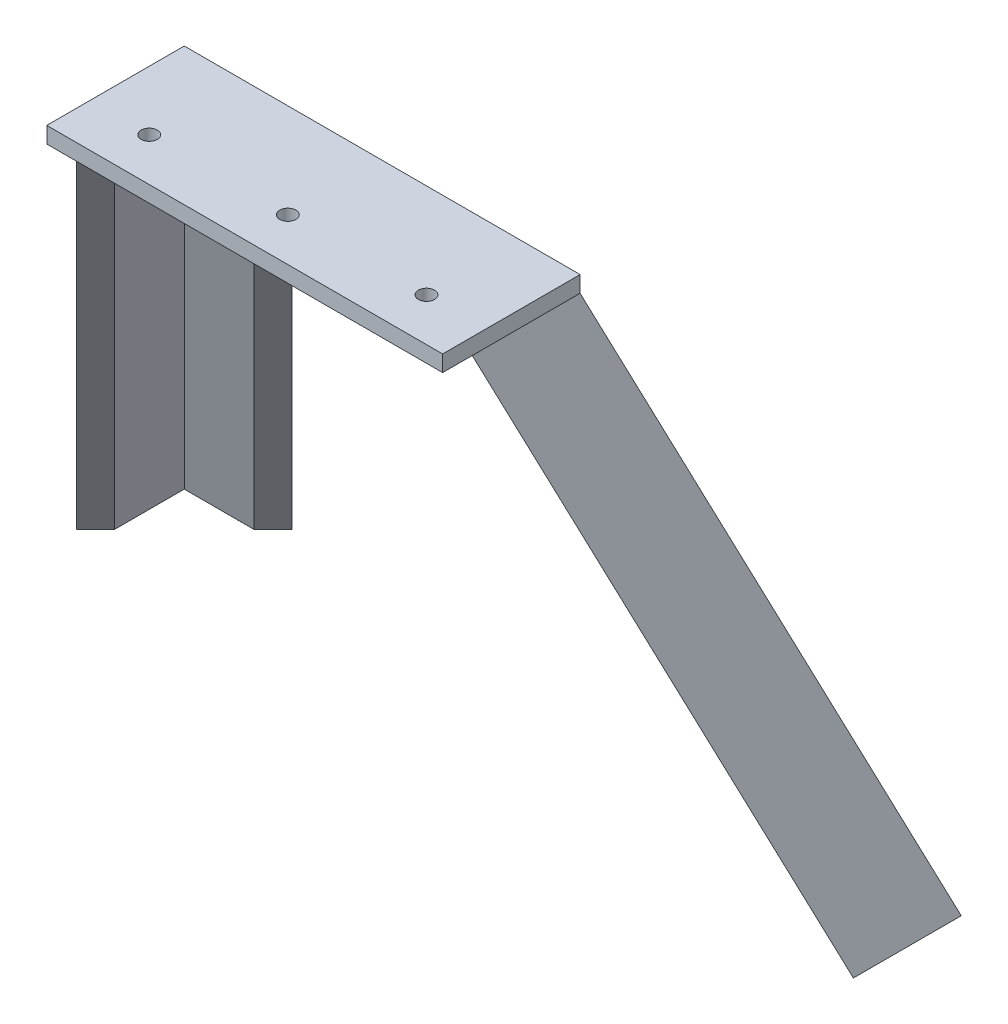
ISO-10303-21;
HEADER;
FILE_DESCRIPTION(('STEP AP214'),'2;1');
FILE_NAME('part.step','',(''),(''),'','','');
FILE_SCHEMA(('AUTOMOTIVE_DESIGN { 1 0 10303 214 1 1 1 1 }'));
ENDSEC;
DATA;
#1=APPLICATION_CONTEXT('core data for automotive mechanical design processes');
#2=APPLICATION_PROTOCOL_DEFINITION('international standard','automotive_design',2000,#1);
#3=PRODUCT_CONTEXT('',#1,'mechanical');
#4=PRODUCT('Part','Part','',(#3));
#5=PRODUCT_RELATED_PRODUCT_CATEGORY('part','',(#4));
#6=PRODUCT_DEFINITION_FORMATION('','',#4);
#7=PRODUCT_DEFINITION_CONTEXT('part definition',#1,'design');
#8=PRODUCT_DEFINITION('design','',#6,#7);
#9=PRODUCT_DEFINITION_SHAPE('','',#8);
#10=(LENGTH_UNIT() NAMED_UNIT(*) SI_UNIT(.MILLI.,.METRE.));
#11=(NAMED_UNIT(*) PLANE_ANGLE_UNIT() SI_UNIT($,.RADIAN.));
#12=(NAMED_UNIT(*) SI_UNIT($,.STERADIAN.) SOLID_ANGLE_UNIT());
#13=UNCERTAINTY_MEASURE_WITH_UNIT(LENGTH_MEASURE(1.E-05),#10,'distance_accuracy_value','');
#14=(GEOMETRIC_REPRESENTATION_CONTEXT(3) GLOBAL_UNCERTAINTY_ASSIGNED_CONTEXT((#13)) GLOBAL_UNIT_ASSIGNED_CONTEXT((#10,
#11,#12)) REPRESENTATION_CONTEXT('',''));
#15=CARTESIAN_POINT('',(0.,0.,0.));
#16=DIRECTION('',(0.,0.,1.));
#17=DIRECTION('',(1.,0.,0.));
#18=AXIS2_PLACEMENT_3D('',#15,#16,#17);
#19=CARTESIAN_POINT('',(31.4906110277381,37.9649951437628,-53.6906110277381));
#20=DIRECTION('',(-0.632455532033676,-0.447213595499958,0.632455532033676));
#21=DIRECTION('',(-0.707106781186548,0.,-0.707106781186548));
#22=AXIS2_PLACEMENT_3D('',#19,#20,#21);
#23=PLANE('',#22);
#24=DIRECTION('',(0.316227766016838,-0.894427190999916,-0.316227766016838));
#25=VECTOR('',#24,1.);
#26=CARTESIAN_POINT('',(9.13098442995433,100.,-32.184865020736));
#27=LINE('',#26,#25);
#28=CARTESIAN_POINT('',(9.13098442995433,100.,-32.184865020736));
#29=VERTEX_POINT('',#28);
#30=CARTESIAN_POINT('',(44.4863234892817,0.,-67.5402040800634));
#31=VERTEX_POINT('',#30);
#32=EDGE_CURVE('E216',#29,#31,#27,.T.);
#33=ORIENTED_EDGE('',*,*,#32,.F.);
#34=CARTESIAN_POINT('',(9.13098442995434,100.,-32.184865020736));
#35=DIRECTION('',(-0.707106781186547,0.,-0.707106781186547));
#36=VECTOR('',#35,1.);
#37=LINE('',#34,#36);
#38=CARTESIAN_POINT('',(5.5954505240216,100.,-35.7203989266688));
#39=VERTEX_POINT('',#38);
#40=EDGE_CURVE('E227',#29,#39,#37,.T.);
#41=ORIENTED_EDGE('',*,*,#40,.T.);
#42=DIRECTION('',(0.316227766016838,-0.894427190999916,-0.316227766016838));
#43=VECTOR('',#42,1.);
#44=CARTESIAN_POINT('',(5.5954505240216,100.,-35.7203989266688));
#45=LINE('',#44,#43);
#46=CARTESIAN_POINT('',(40.950789583349,0.,-71.0757379859962));
#47=VERTEX_POINT('',#46);
#48=EDGE_CURVE('E367',#39,#47,#45,.T.);
#49=ORIENTED_EDGE('',*,*,#48,.T.);
#50=CARTESIAN_POINT('',(44.4863234892817,0.,-67.5402040800634));
#51=DIRECTION('',(-0.707106781186547,0.,-0.707106781186547));
#52=VECTOR('',#51,1.);
#53=LINE('',#50,#52);
#54=EDGE_CURVE('E288',#31,#47,#53,.T.);
#55=ORIENTED_EDGE('',*,*,#54,.F.);
#56=EDGE_LOOP('',(#33,#41,#49,#55));
#57=FACE_BOUND('',#56,.T.);
#58=ADVANCED_FACE('F97',(#57),#23,.T.);
#59=CARTESIAN_POINT('',(-53.6906110277381,37.9649951437628,-53.6906110277381));
#60=DIRECTION('',(0.632455532033676,-0.447213595499958,0.632455532033676));
#61=DIRECTION('',(0.707106781186548,0.,-0.707106781186548));
#62=AXIS2_PLACEMENT_3D('',#59,#60,#61);
#63=PLANE('',#62);
#64=DIRECTION('',(-0.316227766016838,-0.894427190999916,-0.316227766016838));
#65=VECTOR('',#64,1.);
#66=CARTESIAN_POINT('',(-31.3309844299543,100.,-32.184865020736));
#67=LINE('',#66,#65);
#68=CARTESIAN_POINT('',(-31.3309844299543,100.,-32.184865020736));
#69=VERTEX_POINT('',#68);
#70=CARTESIAN_POINT('',(-66.6863234892817,0.,-67.5402040800634));
#71=VERTEX_POINT('',#70);
#72=EDGE_CURVE('E454',#69,#71,#67,.T.);
#73=ORIENTED_EDGE('',*,*,#72,.T.);
#74=DIRECTION('',(0.707106781186548,0.,-0.707106781186548));
#75=VECTOR('',#74,1.);
#76=CARTESIAN_POINT('',(-63.150789583349,0.,-71.0757379859962));
#77=LINE('',#76,#75);
#78=CARTESIAN_POINT('',(-63.150789583349,0.,-71.0757379859962));
#79=VERTEX_POINT('',#78);
#80=EDGE_CURVE('E566',#71,#79,#77,.T.);
#81=ORIENTED_EDGE('',*,*,#80,.T.);
#82=DIRECTION('',(-0.316227766016838,-0.894427190999916,-0.316227766016838));
#83=VECTOR('',#82,1.);
#84=CARTESIAN_POINT('',(-27.7954505240216,100.,-35.7203989266688));
#85=LINE('',#84,#83);
#86=CARTESIAN_POINT('',(-27.7954505240216,100.,-35.7203989266688));
#87=VERTEX_POINT('',#86);
#88=EDGE_CURVE('E572',#87,#79,#85,.T.);
#89=ORIENTED_EDGE('',*,*,#88,.F.);
#90=DIRECTION('',(0.707106781186548,0.,-0.707106781186548));
#91=VECTOR('',#90,1.);
#92=CARTESIAN_POINT('',(-27.7954505240216,100.,-35.7203989266688));
#93=LINE('',#92,#91);
#94=EDGE_CURVE('E464',#69,#87,#93,.T.);
#95=ORIENTED_EDGE('',*,*,#94,.F.);
#96=EDGE_LOOP('',(#73,#81,#89,#95));
#97=FACE_BOUND('',#96,.T.);
#98=ADVANCED_FACE('F408',(#97),#63,.T.);
#99=CARTESIAN_POINT('',(-47.7954505240216,103.,-35.7203989266688));
#100=DIRECTION('',(1.,0.,0.));
#101=DIRECTION('',(0.,0.,-1.));
#102=AXIS2_PLACEMENT_3D('',#99,#100,#101);
#103=PLANE('',#102);
#104=CARTESIAN_POINT('',(-47.7954505240216,100.,-35.7203989266688));
#105=DIRECTION('',(0.,0.,1.));
#106=VECTOR('',#105,1.);
#107=LINE('',#104,#106);
#108=CARTESIAN_POINT('',(-47.7954505240216,100.,-35.7203989266688));
#109=VERTEX_POINT('',#108);
#110=CARTESIAN_POINT('',(-47.7954505240216,100.,-15.7203989266688));
#111=VERTEX_POINT('',#110);
#112=EDGE_CURVE('E489',#109,#111,#107,.T.);
#113=ORIENTED_EDGE('',*,*,#112,.T.);
#114=DIRECTION('',(0.,0.,1.));
#115=VECTOR('',#114,1.);
#116=CARTESIAN_POINT('',(-47.7954505240216,100.,-35.7203989266688));
#117=LINE('',#116,#115);
#118=CARTESIAN_POINT('',(-47.7954505240216,100.,-10.2203989266688));
#119=VERTEX_POINT('',#118);
#120=EDGE_CURVE('E461',#111,#119,#117,.T.);
#121=ORIENTED_EDGE('',*,*,#120,.T.);
#122=DIRECTION('',(0.,-1.,0.));
#123=VECTOR('',#122,1.);
#124=CARTESIAN_POINT('',(-47.7954505240216,103.,-10.2203989266688));
#125=LINE('',#124,#123);
#126=CARTESIAN_POINT('',(-47.7954505240216,103.,-10.2203989266688));
#127=VERTEX_POINT('',#126);
#128=EDGE_CURVE('E12',#127,#119,#125,.T.);
#129=ORIENTED_EDGE('',*,*,#128,.F.);
#130=DIRECTION('',(0.,0.,1.));
#131=VECTOR('',#130,1.);
#132=CARTESIAN_POINT('',(-47.7954505240216,103.,-35.7203989266688));
#133=LINE('',#132,#131);
#134=CARTESIAN_POINT('',(-47.7954505240216,103.,-35.7203989266688));
#135=VERTEX_POINT('',#134);
#136=EDGE_CURVE('E470',#135,#127,#133,.T.);
#137=ORIENTED_EDGE('',*,*,#136,.F.);
#138=DIRECTION('',(0.,-1.,0.));
#139=VECTOR('',#138,1.);
#140=CARTESIAN_POINT('',(-47.7954505240216,103.,-35.7203989266688));
#141=LINE('',#140,#139);
#142=EDGE_CURVE('E496',#135,#109,#141,.T.);
#143=ORIENTED_EDGE('',*,*,#142,.T.);
#144=EDGE_LOOP('',(#113,#121,#129,#137,#143));
#145=FACE_BOUND('',#144,.T.);
#146=ADVANCED_FACE('F99',(#145),#103,.F.);
#147=CARTESIAN_POINT('',(-47.7954505240216,103.,-10.2203989266688));
#148=DIRECTION('',(0.,0.,-1.));
#149=DIRECTION('',(-1.,0.,0.));
#150=AXIS2_PLACEMENT_3D('',#147,#148,#149);
#151=PLANE('',#150);
#152=DIRECTION('',(1.,0.,0.));
#153=VECTOR('',#152,1.);
#154=CARTESIAN_POINT('',(-47.7954505240216,100.,-10.2203989266688));
#155=LINE('',#154,#153);
#156=CARTESIAN_POINT('',(25.6259057159784,100.,-10.2203989266688));
#157=VERTEX_POINT('',#156);
#158=EDGE_CURVE('E483',#119,#157,#155,.T.);
#159=ORIENTED_EDGE('',*,*,#158,.T.);
#160=DIRECTION('',(0.,-1.,0.));
#161=VECTOR('',#160,1.);
#162=CARTESIAN_POINT('',(25.6259057159784,103.,-10.2203989266688));
#163=LINE('',#162,#161);
#164=CARTESIAN_POINT('',(25.6259057159784,103.,-10.2203989266688));
#165=VERTEX_POINT('',#164);
#166=EDGE_CURVE('E110',#165,#157,#163,.T.);
#167=ORIENTED_EDGE('',*,*,#166,.F.);
#168=DIRECTION('',(1.,0.,0.));
#169=VECTOR('',#168,1.);
#170=CARTESIAN_POINT('',(-47.7954505240216,103.,-10.2203989266688));
#171=LINE('',#170,#169);
#172=EDGE_CURVE('E499',#127,#165,#171,.T.);
#173=ORIENTED_EDGE('',*,*,#172,.F.);
#174=ORIENTED_EDGE('',*,*,#128,.T.);
#175=EDGE_LOOP('',(#159,#167,#173,#174));
#176=FACE_BOUND('',#175,.T.);
#177=ADVANCED_FACE('F421',(#176),#151,.F.);
#178=CARTESIAN_POINT('',(25.6259057159784,103.,-35.7203989266688));
#179=DIRECTION('',(-1.,0.,0.));
#180=DIRECTION('',(0.,0.,1.));
#181=AXIS2_PLACEMENT_3D('',#178,#179,#180);
#182=PLANE('',#181);
#183=DIRECTION('',(0.,0.,-1.));
#184=VECTOR('',#183,1.);
#185=CARTESIAN_POINT('',(25.6259057159784,100.,-35.7203989266688));
#186=LINE('',#185,#184);
#187=CARTESIAN_POINT('',(25.6259057159784,100.,-35.7203989266688));
#188=VERTEX_POINT('',#187);
#189=EDGE_CURVE('E476',#157,#188,#186,.T.);
#190=ORIENTED_EDGE('',*,*,#189,.T.);
#191=DIRECTION('',(0.,-1.,0.));
#192=VECTOR('',#191,1.);
#193=CARTESIAN_POINT('',(25.6259057159784,103.,-35.7203989266688));
#194=LINE('',#193,#192);
#195=CARTESIAN_POINT('',(25.6259057159784,103.,-35.7203989266688));
#196=VERTEX_POINT('',#195);
#197=EDGE_CURVE('E478',#196,#188,#194,.T.);
#198=ORIENTED_EDGE('',*,*,#197,.F.);
#199=DIRECTION('',(0.,0.,-1.));
#200=VECTOR('',#199,1.);
#201=CARTESIAN_POINT('',(25.6259057159784,103.,-35.7203989266688));
#202=LINE('',#201,#200);
#203=EDGE_CURVE('E497',#165,#196,#202,.T.);
#204=ORIENTED_EDGE('',*,*,#203,.F.);
#205=ORIENTED_EDGE('',*,*,#166,.T.);
#206=EDGE_LOOP('',(#190,#198,#204,#205));
#207=FACE_BOUND('',#206,.T.);
#208=ADVANCED_FACE('F729',(#207),#182,.F.);
#209=CARTESIAN_POINT('',(-47.7954505240216,103.,-35.7203989266688));
#210=DIRECTION('',(0.,0.,1.));
#211=DIRECTION('',(1.,0.,0.));
#212=AXIS2_PLACEMENT_3D('',#209,#210,#211);
#213=PLANE('',#212);
#214=DIRECTION('',(-1.,0.,0.));
#215=VECTOR('',#214,1.);
#216=CARTESIAN_POINT('',(-47.7954505240216,100.,-35.7203989266688));
#217=LINE('',#216,#215);
#218=CARTESIAN_POINT('',(25.5954505240216,100.,-35.7203989266688));
#219=VERTEX_POINT('',#218);
#220=EDGE_CURVE('E467',#188,#219,#217,.T.);
#221=ORIENTED_EDGE('',*,*,#220,.T.);
#222=CARTESIAN_POINT('',(25.5954505240216,100.,-35.7203989266688));
#223=DIRECTION('',(-1.,0.,0.));
#224=VECTOR('',#223,1.);
#225=LINE('',#222,#224);
#226=EDGE_CURVE('E363',#219,#39,#225,.T.);
#227=ORIENTED_EDGE('',*,*,#226,.T.);
#228=EDGE_CURVE('E471',#39,#87,#217,.T.);
#229=ORIENTED_EDGE('',*,*,#228,.T.);
#230=DIRECTION('',(-1.,0.,0.));
#231=VECTOR('',#230,1.);
#232=CARTESIAN_POINT('',(-47.7954505240216,100.,-35.7203989266688));
#233=LINE('',#232,#231);
#234=EDGE_CURVE('E463',#87,#109,#233,.T.);
#235=ORIENTED_EDGE('',*,*,#234,.T.);
#236=ORIENTED_EDGE('',*,*,#142,.F.);
#237=DIRECTION('',(-1.,0.,0.));
#238=VECTOR('',#237,1.);
#239=CARTESIAN_POINT('',(-47.7954505240216,103.,-35.7203989266688));
#240=LINE('',#239,#238);
#241=EDGE_CURVE('E494',#196,#135,#240,.T.);
#242=ORIENTED_EDGE('',*,*,#241,.F.);
#243=ORIENTED_EDGE('',*,*,#197,.T.);
#244=EDGE_LOOP('',(#221,#227,#229,#235,#236,#242,#243));
#245=FACE_BOUND('',#244,.T.);
#246=ADVANCED_FACE('F311',(#245),#213,.F.);
#247=CARTESIAN_POINT('',(0.,103.,0.));
#248=DIRECTION('',(0.,1.,0.));
#249=DIRECTION('',(0.,0.,1.));
#250=AXIS2_PLACEMENT_3D('',#247,#248,#249);
#251=PLANE('',#250);
#252=CARTESIAN_POINT('',(-36.7954505240216,103.,-18.2203989266688));
#253=DIRECTION('',(0.,1.,0.));
#254=DIRECTION('',(0.,0.,1.));
#255=AXIS2_PLACEMENT_3D('',#252,#253,#254);
#256=CIRCLE('',#255,1.5);
#257=CARTESIAN_POINT('',(-36.7954505240216,103.,-16.7203989266688));
#258=VERTEX_POINT('',#257);
#259=EDGE_CURVE('E516',#258,#258,#256,.T.);
#260=ORIENTED_EDGE('',*,*,#259,.F.);
#261=EDGE_LOOP('',(#260));
#262=FACE_BOUND('',#261,.T.);
#263=CARTESIAN_POINT('',(14.6259057159784,103.,-18.2203989266688));
#264=DIRECTION('',(0.,1.,0.));
#265=DIRECTION('',(0.,0.,1.));
#266=AXIS2_PLACEMENT_3D('',#263,#264,#265);
#267=CIRCLE('',#266,1.5);
#268=CARTESIAN_POINT('',(14.6259057159784,103.,-16.7203989266688));
#269=VERTEX_POINT('',#268);
#270=EDGE_CURVE('E510',#269,#269,#267,.T.);
#271=ORIENTED_EDGE('',*,*,#270,.F.);
#272=EDGE_LOOP('',(#271));
#273=FACE_BOUND('',#272,.T.);
#274=CARTESIAN_POINT('',(-11.0847724040216,103.,-18.2203989266688));
#275=DIRECTION('',(0.,1.,0.));
#276=DIRECTION('',(0.,0.,1.));
#277=AXIS2_PLACEMENT_3D('',#274,#275,#276);
#278=CIRCLE('',#277,1.5);
#279=CARTESIAN_POINT('',(-11.0847724040216,103.,-16.7203989266688));
#280=VERTEX_POINT('',#279);
#281=EDGE_CURVE('E503',#280,#280,#278,.T.);
#282=ORIENTED_EDGE('',*,*,#281,.F.);
#283=EDGE_LOOP('',(#282));
#284=FACE_BOUND('',#283,.T.);
#285=ORIENTED_EDGE('',*,*,#136,.T.);
#286=ORIENTED_EDGE('',*,*,#172,.T.);
#287=ORIENTED_EDGE('',*,*,#203,.T.);
#288=ORIENTED_EDGE('',*,*,#241,.T.);
#289=EDGE_LOOP('',(#285,#286,#287,#288));
#290=FACE_BOUND('',#289,.T.);
#291=ADVANCED_FACE('F308',(#262,#273,#284,#290),#251,.T.);
#292=CARTESIAN_POINT('',(0.,100.,0.));
#293=DIRECTION('',(0.,1.,0.));
#294=DIRECTION('',(0.,0.,1.));
#295=AXIS2_PLACEMENT_3D('',#292,#293,#294);
#296=PLANE('',#295);
#297=CARTESIAN_POINT('',(-36.7954505240216,100.,-18.2203989266688));
#298=DIRECTION('',(0.,1.,0.));
#299=DIRECTION('',(0.,0.,1.));
#300=AXIS2_PLACEMENT_3D('',#297,#298,#299);
#301=CIRCLE('',#300,1.5);
#302=CARTESIAN_POINT('',(-36.7954505240216,100.,-16.7203989266688));
#303=VERTEX_POINT('',#302);
#304=EDGE_CURVE('E519',#303,#303,#301,.T.);
#305=ORIENTED_EDGE('',*,*,#304,.T.);
#306=EDGE_LOOP('',(#305));
#307=FACE_BOUND('',#306,.T.);
#308=CARTESIAN_POINT('',(14.6259057159784,100.,-18.2203989266688));
#309=DIRECTION('',(0.,1.,0.));
#310=DIRECTION('',(0.,0.,1.));
#311=AXIS2_PLACEMENT_3D('',#308,#309,#310);
#312=CIRCLE('',#311,1.5);
#313=CARTESIAN_POINT('',(14.6259057159784,100.,-16.7203989266688));
#314=VERTEX_POINT('',#313);
#315=EDGE_CURVE('E513',#314,#314,#312,.T.);
#316=ORIENTED_EDGE('',*,*,#315,.T.);
#317=EDGE_LOOP('',(#316));
#318=FACE_BOUND('',#317,.T.);
#319=CARTESIAN_POINT('',(-11.0847724040216,100.,-18.2203989266688));
#320=DIRECTION('',(0.,1.,0.));
#321=DIRECTION('',(0.,0.,1.));
#322=AXIS2_PLACEMENT_3D('',#319,#320,#321);
#323=CIRCLE('',#322,1.5);
#324=CARTESIAN_POINT('',(-11.0847724040216,100.,-16.7203989266688));
#325=VERTEX_POINT('',#324);
#326=EDGE_CURVE('E506',#325,#325,#323,.T.);
#327=ORIENTED_EDGE('',*,*,#326,.T.);
#328=EDGE_LOOP('',(#327));
#329=FACE_BOUND('',#328,.T.);
#330=ORIENTED_EDGE('',*,*,#228,.F.);
#331=ORIENTED_EDGE('',*,*,#40,.F.);
#332=CARTESIAN_POINT('',(9.13098442995433,100.,-32.184865020736));
#333=DIRECTION('',(1.,0.,0.));
#334=VECTOR('',#333,1.);
#335=LINE('',#332,#334);
#336=CARTESIAN_POINT('',(22.0599166180889,100.,-32.184865020736));
#337=VERTEX_POINT('',#336);
#338=EDGE_CURVE('E210',#29,#337,#335,.T.);
#339=ORIENTED_EDGE('',*,*,#338,.T.);
#340=CARTESIAN_POINT('',(22.0599166180889,100.,-32.184865020736));
#341=DIRECTION('',(0.,0.,1.));
#342=VECTOR('',#341,1.);
#343=LINE('',#340,#342);
#344=CARTESIAN_POINT('',(22.0599166180889,100.,-19.2559328326015));
#345=VERTEX_POINT('',#344);
#346=EDGE_CURVE('E224',#337,#345,#343,.T.);
#347=ORIENTED_EDGE('',*,*,#346,.T.);
#348=CARTESIAN_POINT('',(25.5954505240216,100.,-15.7203989266688));
#349=DIRECTION('',(-0.707106781186548,0.,-0.707106781186548));
#350=VECTOR('',#349,1.);
#351=LINE('',#348,#350);
#352=CARTESIAN_POINT('',(25.5954505240216,100.,-15.7203989266688));
#353=VERTEX_POINT('',#352);
#354=EDGE_CURVE('E362',#353,#345,#351,.T.);
#355=ORIENTED_EDGE('',*,*,#354,.F.);
#356=DIRECTION('',(0.,0.,-1.));
#357=VECTOR('',#356,1.);
#358=CARTESIAN_POINT('',(25.5954505240216,100.,0.));
#359=LINE('',#358,#357);
#360=EDGE_CURVE('E294',#219,#353,#359,.F.);
#361=ORIENTED_EDGE('',*,*,#360,.F.);
#362=ORIENTED_EDGE('',*,*,#220,.F.);
#363=ORIENTED_EDGE('',*,*,#189,.F.);
#364=ORIENTED_EDGE('',*,*,#158,.F.);
#365=ORIENTED_EDGE('',*,*,#120,.F.);
#366=CARTESIAN_POINT('',(-44.2599166180888,100.,-19.2559328326015));
#367=VERTEX_POINT('',#366);
#368=EDGE_CURVE('E445',#111,#367,#93,.T.);
#369=ORIENTED_EDGE('',*,*,#368,.T.);
#370=DIRECTION('',(0.,0.,1.));
#371=VECTOR('',#370,1.);
#372=CARTESIAN_POINT('',(-44.2599166180889,100.,-32.184865020736));
#373=LINE('',#372,#371);
#374=CARTESIAN_POINT('',(-44.2599166180889,100.,-32.184865020736));
#375=VERTEX_POINT('',#374);
#376=EDGE_CURVE('E387',#375,#367,#373,.T.);
#377=ORIENTED_EDGE('',*,*,#376,.F.);
#378=DIRECTION('',(-1.,0.,0.));
#379=VECTOR('',#378,1.);
#380=CARTESIAN_POINT('',(-44.2599166180889,100.,-32.184865020736));
#381=LINE('',#380,#379);
#382=EDGE_CURVE('E389',#69,#375,#381,.T.);
#383=ORIENTED_EDGE('',*,*,#382,.F.);
#384=ORIENTED_EDGE('',*,*,#94,.T.);
#385=EDGE_LOOP('',(#330,#331,#339,#347,#355,#361,#362,#363,#364,#365,#369,#377,#383,#384));
#386=FACE_BOUND('',#385,.T.);
#387=ADVANCED_FACE('F222',(#307,#318,#329,#386),#296,.F.);
#388=CARTESIAN_POINT('',(-11.0847724040216,100.,-18.2203989266688));
#389=DIRECTION('',(0.,1.,0.));
#390=DIRECTION('',(0.,0.,1.));
#391=AXIS2_PLACEMENT_3D('',#388,#389,#390);
#392=CYLINDRICAL_SURFACE('',#391,1.5);
#393=ORIENTED_EDGE('',*,*,#326,.F.);
#394=EDGE_LOOP('',(#393));
#395=FACE_BOUND('',#394,.T.);
#396=ORIENTED_EDGE('',*,*,#281,.T.);
#397=EDGE_LOOP('',(#396));
#398=FACE_BOUND('',#397,.T.);
#399=ADVANCED_FACE('F307',(#395,#398),#392,.F.);
#400=CARTESIAN_POINT('',(14.6259057159784,100.,-18.2203989266688));
#401=DIRECTION('',(0.,1.,0.));
#402=DIRECTION('',(0.,0.,1.));
#403=AXIS2_PLACEMENT_3D('',#400,#401,#402);
#404=CYLINDRICAL_SURFACE('',#403,1.5);
#405=ORIENTED_EDGE('',*,*,#315,.F.);
#406=EDGE_LOOP('',(#405));
#407=FACE_BOUND('',#406,.T.);
#408=ORIENTED_EDGE('',*,*,#270,.T.);
#409=EDGE_LOOP('',(#408));
#410=FACE_BOUND('',#409,.T.);
#411=ADVANCED_FACE('F751',(#407,#410),#404,.F.);
#412=CARTESIAN_POINT('',(-36.7954505240216,100.,-18.2203989266688));
#413=DIRECTION('',(0.,1.,0.));
#414=DIRECTION('',(0.,0.,1.));
#415=AXIS2_PLACEMENT_3D('',#412,#413,#414);
#416=CYLINDRICAL_SURFACE('',#415,1.5);
#417=ORIENTED_EDGE('',*,*,#304,.F.);
#418=EDGE_LOOP('',(#417));
#419=FACE_BOUND('',#418,.T.);
#420=ORIENTED_EDGE('',*,*,#259,.T.);
#421=EDGE_LOOP('',(#420));
#422=FACE_BOUND('',#421,.T.);
#423=ADVANCED_FACE('F437',(#419,#422),#416,.F.);
#424=CARTESIAN_POINT('',(0.,0.,0.));
#425=DIRECTION('',(0.,-1.,0.));
#426=DIRECTION('',(0.,0.,-1.));
#427=AXIS2_PLACEMENT_3D('',#424,#425,#426);
#428=PLANE('',#427);
#429=DIRECTION('',(-1.,0.,0.));
#430=VECTOR('',#429,1.);
#431=CARTESIAN_POINT('',(-79.6152556774162,0.,-67.5402040800634));
#432=LINE('',#431,#430);
#433=CARTESIAN_POINT('',(-79.6152556774162,0.,-67.5402040800634));
#434=VERTEX_POINT('',#433);
#435=EDGE_CURVE('E610',#71,#434,#432,.T.);
#436=ORIENTED_EDGE('',*,*,#435,.T.);
#437=DIRECTION('',(0.,0.,1.));
#438=VECTOR('',#437,1.);
#439=CARTESIAN_POINT('',(-79.6152556774162,0.,-67.5402040800634));
#440=LINE('',#439,#438);
#441=CARTESIAN_POINT('',(-79.6152556774162,0.,-54.6112718919289));
#442=VERTEX_POINT('',#441);
#443=EDGE_CURVE('E611',#434,#442,#440,.T.);
#444=ORIENTED_EDGE('',*,*,#443,.T.);
#445=CARTESIAN_POINT('',(-83.150789583349,0.,-51.0757379859962));
#446=VERTEX_POINT('',#445);
#447=EDGE_CURVE('E449',#446,#442,#77,.T.);
#448=ORIENTED_EDGE('',*,*,#447,.F.);
#449=DIRECTION('',(0.,0.,1.));
#450=VECTOR('',#449,1.);
#451=CARTESIAN_POINT('',(-83.150789583349,0.,-51.0757379859962));
#452=LINE('',#451,#450);
#453=CARTESIAN_POINT('',(-83.150789583349,0.,-71.0757379859962));
#454=VERTEX_POINT('',#453);
#455=EDGE_CURVE('E550',#454,#446,#452,.T.);
#456=ORIENTED_EDGE('',*,*,#455,.F.);
#457=DIRECTION('',(-1.,0.,0.));
#458=VECTOR('',#457,1.);
#459=CARTESIAN_POINT('',(-83.150789583349,0.,-71.0757379859962));
#460=LINE('',#459,#458);
#461=EDGE_CURVE('E507',#79,#454,#460,.T.);
#462=ORIENTED_EDGE('',*,*,#461,.F.);
#463=ORIENTED_EDGE('',*,*,#80,.F.);
#464=EDGE_LOOP('',(#436,#444,#448,#456,#462,#463));
#465=FACE_BOUND('',#464,.T.);
#466=ADVANCED_FACE('F429',(#465),#428,.T.);
#467=DIRECTION('',(-0.316227766016838,-0.894427190999916,-0.316227766016838));
#468=VECTOR('',#467,1.);
#469=CARTESIAN_POINT('',(-44.2599166180889,100.,-19.2559328326015));
#470=LINE('',#469,#468);
#471=EDGE_CURVE('E442',#367,#442,#470,.T.);
#472=ORIENTED_EDGE('',*,*,#471,.F.);
#473=ORIENTED_EDGE('',*,*,#368,.F.);
#474=DIRECTION('',(-0.316227766016838,-0.894427190999916,-0.316227766016838));
#475=VECTOR('',#474,1.);
#476=CARTESIAN_POINT('',(-47.7954505240216,100.,-15.7203989266688));
#477=LINE('',#476,#475);
#478=EDGE_CURVE('E576',#111,#446,#477,.T.);
#479=ORIENTED_EDGE('',*,*,#478,.T.);
#480=ORIENTED_EDGE('',*,*,#447,.T.);
#481=EDGE_LOOP('',(#472,#473,#479,#480));
#482=FACE_BOUND('',#481,.T.);
#483=ADVANCED_FACE('F415',(#482),#63,.T.);
#484=CARTESIAN_POINT('',(0.,22.336949470105,-63.1784337653299));
#485=DIRECTION('',(0.,0.333333333333333,-0.942809041582063));
#486=DIRECTION('',(0.,0.942809041582063,0.333333333333333));
#487=AXIS2_PLACEMENT_3D('',#484,#485,#486);
#488=PLANE('',#487);
#489=ORIENTED_EDGE('',*,*,#88,.T.);
#490=ORIENTED_EDGE('',*,*,#461,.T.);
#491=DIRECTION('',(-0.316227766016838,-0.894427190999916,-0.316227766016838));
#492=VECTOR('',#491,1.);
#493=CARTESIAN_POINT('',(-47.7954505240216,100.,-35.7203989266688));
#494=LINE('',#493,#492);
#495=EDGE_CURVE('E575',#109,#454,#494,.T.);
#496=ORIENTED_EDGE('',*,*,#495,.F.);
#497=ORIENTED_EDGE('',*,*,#234,.F.);
#498=EDGE_LOOP('',(#489,#490,#496,#497));
#499=FACE_BOUND('',#498,.T.);
#500=ADVANCED_FACE('F428',(#499),#488,.T.);
#501=CARTESIAN_POINT('',(-73.9118129629769,26.1317720779564,0.));
#502=DIRECTION('',(-0.942809041582063,0.333333333333333,0.));
#503=DIRECTION('',(-0.333333333333333,-0.942809041582063,0.));
#504=AXIS2_PLACEMENT_3D('',#501,#502,#503);
#505=PLANE('',#504);
#506=ORIENTED_EDGE('',*,*,#495,.T.);
#507=ORIENTED_EDGE('',*,*,#455,.T.);
#508=ORIENTED_EDGE('',*,*,#478,.F.);
#509=ORIENTED_EDGE('',*,*,#112,.F.);
#510=EDGE_LOOP('',(#506,#507,#508,#509));
#511=FACE_BOUND('',#510,.T.);
#512=ADVANCED_FACE('F435',(#511),#505,.T.);
#513=CARTESIAN_POINT('',(0.,21.2258383589938,-60.0357369600564));
#514=DIRECTION('',(0.,0.333333333333333,-0.942809041582063));
#515=DIRECTION('',(0.,0.942809041582063,0.333333333333333));
#516=AXIS2_PLACEMENT_3D('',#513,#514,#515);
#517=PLANE('',#516);
#518=ORIENTED_EDGE('',*,*,#72,.F.);
#519=ORIENTED_EDGE('',*,*,#382,.T.);
#520=DIRECTION('',(-0.316227766016838,-0.894427190999916,-0.316227766016838));
#521=VECTOR('',#520,1.);
#522=CARTESIAN_POINT('',(-44.2599166180889,100.,-32.184865020736));
#523=LINE('',#522,#521);
#524=EDGE_CURVE('E646',#375,#434,#523,.T.);
#525=ORIENTED_EDGE('',*,*,#524,.T.);
#526=ORIENTED_EDGE('',*,*,#435,.F.);
#527=EDGE_LOOP('',(#518,#519,#525,#526));
#528=FACE_BOUND('',#527,.T.);
#529=ADVANCED_FACE('F658',(#528),#517,.F.);
#530=CARTESIAN_POINT('',(-70.7691161577033,25.0206609668452,0.));
#531=DIRECTION('',(-0.942809041582063,0.333333333333333,0.));
#532=DIRECTION('',(-0.333333333333333,-0.942809041582063,0.));
#533=AXIS2_PLACEMENT_3D('',#530,#531,#532);
#534=PLANE('',#533);
#535=ORIENTED_EDGE('',*,*,#524,.F.);
#536=ORIENTED_EDGE('',*,*,#376,.T.);
#537=ORIENTED_EDGE('',*,*,#471,.T.);
#538=ORIENTED_EDGE('',*,*,#443,.F.);
#539=EDGE_LOOP('',(#535,#536,#537,#538));
#540=FACE_BOUND('',#539,.T.);
#541=ADVANCED_FACE('F656',(#540),#534,.F.);
#542=CARTESIAN_POINT('',(-22.2,0.,0.));
#543=DIRECTION('',(0.,-1.,0.));
#544=DIRECTION('',(0.,0.,-1.));
#545=AXIS2_PLACEMENT_3D('',#542,#543,#544);
#546=PLANE('',#545);
#547=DIRECTION('',(1.,0.,0.));
#548=VECTOR('',#547,1.);
#549=CARTESIAN_POINT('',(-22.2,0.,-67.5402040800634));
#550=LINE('',#549,#548);
#551=CARTESIAN_POINT('',(57.4152556774162,0.,-67.5402040800634));
#552=VERTEX_POINT('',#551);
#553=EDGE_CURVE('E214',#31,#552,#550,.T.);
#554=ORIENTED_EDGE('',*,*,#553,.F.);
#555=ORIENTED_EDGE('',*,*,#54,.T.);
#556=CARTESIAN_POINT('',(40.950789583349,0.,-71.0757379859962));
#557=DIRECTION('',(1.,0.,0.));
#558=VECTOR('',#557,1.);
#559=LINE('',#556,#558);
#560=CARTESIAN_POINT('',(60.950789583349,0.,-71.0757379859962));
#561=VERTEX_POINT('',#560);
#562=EDGE_CURVE('E377',#47,#561,#559,.T.);
#563=ORIENTED_EDGE('',*,*,#562,.T.);
#564=CARTESIAN_POINT('',(60.950789583349,0.,-71.0757379859962));
#565=DIRECTION('',(0.,0.,1.));
#566=VECTOR('',#565,1.);
#567=LINE('',#564,#566);
#568=CARTESIAN_POINT('',(60.950789583349,0.,-51.0757379859962));
#569=VERTEX_POINT('',#568);
#570=EDGE_CURVE('E388',#561,#569,#567,.T.);
#571=ORIENTED_EDGE('',*,*,#570,.T.);
#572=CARTESIAN_POINT('',(60.950789583349,0.,-51.0757379859962));
#573=DIRECTION('',(-0.707106781186547,0.,-0.707106781186548));
#574=VECTOR('',#573,1.);
#575=LINE('',#572,#574);
#576=CARTESIAN_POINT('',(57.4152556774162,0.,-54.6112718919289));
#577=VERTEX_POINT('',#576);
#578=EDGE_CURVE('E391',#569,#577,#575,.T.);
#579=ORIENTED_EDGE('',*,*,#578,.T.);
#580=DIRECTION('',(0.,0.,-1.));
#581=VECTOR('',#580,1.);
#582=CARTESIAN_POINT('',(57.4152556774162,0.,0.));
#583=LINE('',#582,#581);
#584=EDGE_CURVE('E118',#552,#577,#583,.F.);
#585=ORIENTED_EDGE('',*,*,#584,.F.);
#586=EDGE_LOOP('',(#554,#555,#563,#571,#579,#585));
#587=FACE_BOUND('',#586,.T.);
#588=ADVANCED_FACE('F257',(#587),#546,.T.);
#589=DIRECTION('',(0.316227766016838,-0.894427190999916,-0.316227766016838));
#590=VECTOR('',#589,1.);
#591=CARTESIAN_POINT('',(22.0599166180889,100.,-19.2559328326015));
#592=LINE('',#591,#590);
#593=EDGE_CURVE('E229',#345,#577,#592,.T.);
#594=ORIENTED_EDGE('',*,*,#593,.T.);
#595=ORIENTED_EDGE('',*,*,#578,.F.);
#596=DIRECTION('',(0.316227766016838,-0.894427190999916,-0.316227766016838));
#597=VECTOR('',#596,1.);
#598=CARTESIAN_POINT('',(25.5954505240216,100.,-15.7203989266688));
#599=LINE('',#598,#597);
#600=EDGE_CURVE('E364',#353,#569,#599,.T.);
#601=ORIENTED_EDGE('',*,*,#600,.F.);
#602=ORIENTED_EDGE('',*,*,#354,.T.);
#603=EDGE_LOOP('',(#594,#595,#601,#602));
#604=FACE_BOUND('',#603,.T.);
#605=ADVANCED_FACE('F252',(#604),#23,.T.);
#606=CARTESIAN_POINT('',(-22.2,22.336949470105,-63.1784337653299));
#607=DIRECTION('',(0.,0.333333333333333,-0.942809041582063));
#608=DIRECTION('',(0.,0.942809041582063,0.333333333333333));
#609=AXIS2_PLACEMENT_3D('',#606,#607,#608);
#610=PLANE('',#609);
#611=ORIENTED_EDGE('',*,*,#48,.F.);
#612=ORIENTED_EDGE('',*,*,#226,.F.);
#613=DIRECTION('',(0.316227766016838,-0.894427190999916,-0.316227766016838));
#614=VECTOR('',#613,1.);
#615=CARTESIAN_POINT('',(25.5954505240216,100.,-35.7203989266688));
#616=LINE('',#615,#614);
#617=EDGE_CURVE('E369',#219,#561,#616,.T.);
#618=ORIENTED_EDGE('',*,*,#617,.T.);
#619=ORIENTED_EDGE('',*,*,#562,.F.);
#620=EDGE_LOOP('',(#611,#612,#618,#619));
#621=FACE_BOUND('',#620,.T.);
#622=ADVANCED_FACE('F256',(#621),#610,.T.);
#623=CARTESIAN_POINT('',(51.7118129629769,26.1317720779564,0.));
#624=DIRECTION('',(0.942809041582063,0.333333333333333,0.));
#625=DIRECTION('',(0.333333333333333,-0.942809041582063,0.));
#626=AXIS2_PLACEMENT_3D('',#623,#624,#625);
#627=PLANE('',#626);
#628=ORIENTED_EDGE('',*,*,#617,.F.);
#629=ORIENTED_EDGE('',*,*,#360,.T.);
#630=ORIENTED_EDGE('',*,*,#600,.T.);
#631=ORIENTED_EDGE('',*,*,#570,.F.);
#632=EDGE_LOOP('',(#628,#629,#630,#631));
#633=FACE_BOUND('',#632,.T.);
#634=ADVANCED_FACE('F703',(#633),#627,.T.);
#635=CARTESIAN_POINT('',(-22.2,21.2258383589938,-60.0357369600564));
#636=DIRECTION('',(0.,0.333333333333333,-0.942809041582063));
#637=DIRECTION('',(0.,0.942809041582063,0.333333333333333));
#638=AXIS2_PLACEMENT_3D('',#635,#636,#637);
#639=PLANE('',#638);
#640=ORIENTED_EDGE('',*,*,#32,.T.);
#641=ORIENTED_EDGE('',*,*,#553,.T.);
#642=DIRECTION('',(0.316227766016838,-0.894427190999916,-0.316227766016838));
#643=VECTOR('',#642,1.);
#644=CARTESIAN_POINT('',(22.0599166180889,100.,-32.184865020736));
#645=LINE('',#644,#643);
#646=EDGE_CURVE('E207',#337,#552,#645,.T.);
#647=ORIENTED_EDGE('',*,*,#646,.F.);
#648=ORIENTED_EDGE('',*,*,#338,.F.);
#649=EDGE_LOOP('',(#640,#641,#647,#648));
#650=FACE_BOUND('',#649,.T.);
#651=ADVANCED_FACE('F209',(#650),#639,.F.);
#652=CARTESIAN_POINT('',(48.5691161577033,25.0206609668452,0.));
#653=DIRECTION('',(0.942809041582063,0.333333333333333,0.));
#654=DIRECTION('',(0.333333333333333,-0.942809041582063,0.));
#655=AXIS2_PLACEMENT_3D('',#652,#653,#654);
#656=PLANE('',#655);
#657=ORIENTED_EDGE('',*,*,#646,.T.);
#658=ORIENTED_EDGE('',*,*,#584,.T.);
#659=ORIENTED_EDGE('',*,*,#593,.F.);
#660=ORIENTED_EDGE('',*,*,#346,.F.);
#661=EDGE_LOOP('',(#657,#658,#659,#660));
#662=FACE_BOUND('',#661,.T.);
#663=ADVANCED_FACE('F232',(#662),#656,.F.);
#664=CLOSED_SHELL('',(#58,#98,#146,#177,#208,#246,#291,#387,#399,#411,#423,#466,#483,#500,#512,
#529,#541,#588,#605,#622,#634,#651,#663));
#665=MANIFOLD_SOLID_BREP('B2',#664);
#666=ADVANCED_BREP_SHAPE_REPRESENTATION('',(#18,#665),#14);
#667=SHAPE_DEFINITION_REPRESENTATION(#9,#666);
ENDSEC;
END-ISO-10303-21;
